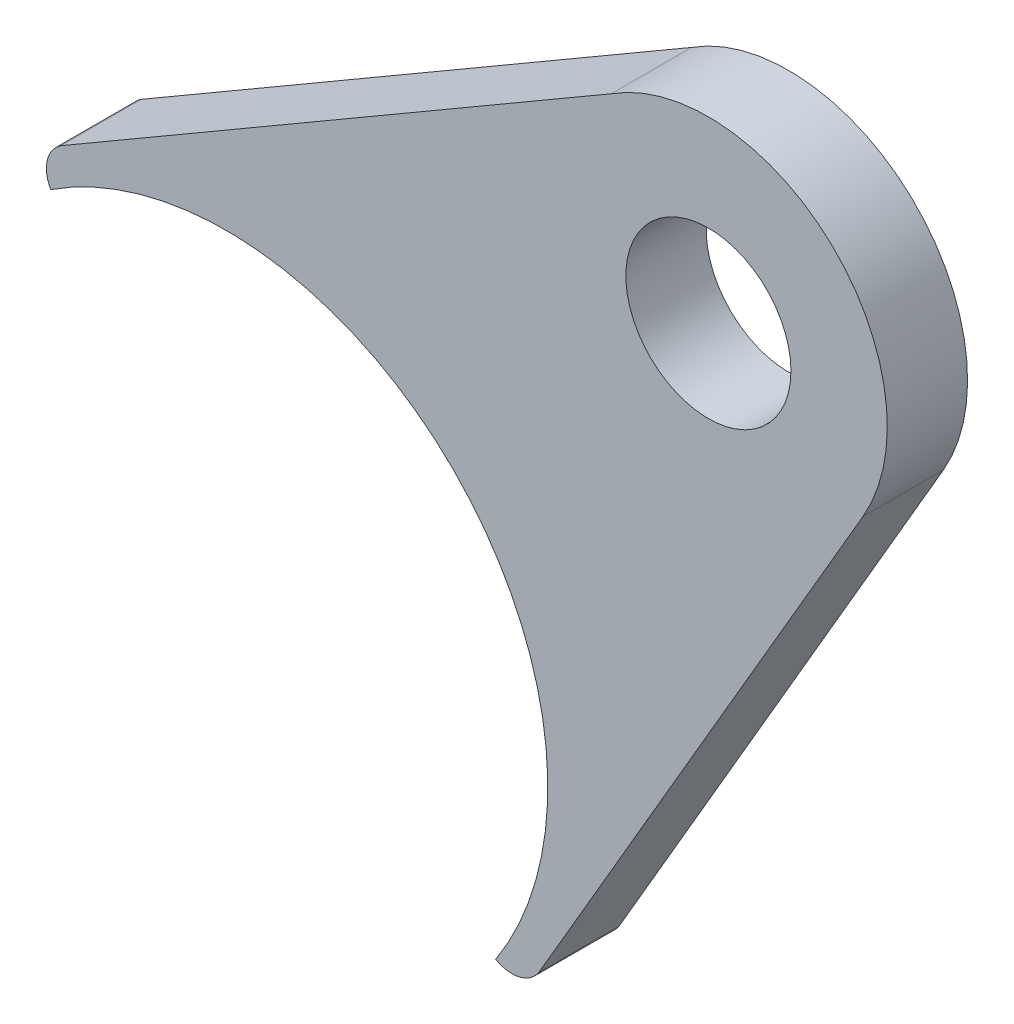
ISO-10303-21;
HEADER;
FILE_DESCRIPTION(('STEP AP214'),'2;1');
FILE_NAME('part.step','',(''),(''),'','','');
FILE_SCHEMA(('AUTOMOTIVE_DESIGN { 1 0 10303 214 1 1 1 1 }'));
ENDSEC;
DATA;
#1=APPLICATION_CONTEXT('core data for automotive mechanical design processes');
#2=APPLICATION_PROTOCOL_DEFINITION('international standard','automotive_design',2000,#1);
#3=PRODUCT_CONTEXT('',#1,'mechanical');
#4=PRODUCT('Part','Part','',(#3));
#5=PRODUCT_RELATED_PRODUCT_CATEGORY('part','',(#4));
#6=PRODUCT_DEFINITION_FORMATION('','',#4);
#7=PRODUCT_DEFINITION_CONTEXT('part definition',#1,'design');
#8=PRODUCT_DEFINITION('design','',#6,#7);
#9=PRODUCT_DEFINITION_SHAPE('','',#8);
#10=(LENGTH_UNIT() NAMED_UNIT(*) SI_UNIT(.MILLI.,.METRE.));
#11=(NAMED_UNIT(*) PLANE_ANGLE_UNIT() SI_UNIT($,.RADIAN.));
#12=(NAMED_UNIT(*) SI_UNIT($,.STERADIAN.) SOLID_ANGLE_UNIT());
#13=UNCERTAINTY_MEASURE_WITH_UNIT(LENGTH_MEASURE(1.E-05),#10,'distance_accuracy_value','');
#14=(GEOMETRIC_REPRESENTATION_CONTEXT(3) GLOBAL_UNCERTAINTY_ASSIGNED_CONTEXT((#13)) GLOBAL_UNIT_ASSIGNED_CONTEXT((#10,
#11,#12)) REPRESENTATION_CONTEXT('',''));
#15=CARTESIAN_POINT('',(0.,0.,0.));
#16=DIRECTION('',(0.,0.,1.));
#17=DIRECTION('',(1.,0.,0.));
#18=AXIS2_PLACEMENT_3D('',#15,#16,#17);
#19=CARTESIAN_POINT('',(-5.85837434433906,11.2675371729913,3.175));
#20=DIRECTION('',(0.,0.,-1.));
#21=DIRECTION('',(-1.,0.,0.));
#22=AXIS2_PLACEMENT_3D('',#19,#20,#21);
#23=PLANE('',#22);
#24=CARTESIAN_POINT('',(-5.85837434433906,11.2675371729913,3.175));
#25=DIRECTION('',(0.,0.,1.));
#26=DIRECTION('',(-1.,0.,0.));
#27=AXIS2_PLACEMENT_3D('',#24,#25,#26);
#28=CIRCLE('',#27,1.26999999999994);
#29=CARTESIAN_POINT('',(-6.54906316048158,12.3332993224671,3.175));
#30=VERTEX_POINT('',#29);
#31=CARTESIAN_POINT('',(-6.9547066047242,10.6264790049294,3.175));
#32=VERTEX_POINT('',#31);
#33=EDGE_CURVE('E139',#30,#32,#28,.T.);
#34=ORIENTED_EDGE('',*,*,#33,.T.);
#35=CARTESIAN_POINT('',(0.,0.,3.175));
#36=DIRECTION('',(0.,0.,-1.));
#37=DIRECTION('',(1.,0.,0.));
#38=AXIS2_PLACEMENT_3D('',#35,#36,#37);
#39=CIRCLE('',#38,12.7);
#40=CARTESIAN_POINT('',(10.6407084109418,-6.93291601804849,3.175));
#41=VERTEX_POINT('',#40);
#42=EDGE_CURVE('E97',#32,#41,#39,.T.);
#43=ORIENTED_EDGE('',*,*,#42,.T.);
#44=CARTESIAN_POINT('',(11.2818459493319,-5.83663017171689,3.175));
#45=DIRECTION('',(0.,0.,1.));
#46=DIRECTION('',(1.,0.,0.));
#47=AXIS2_PLACEMENT_3D('',#44,#45,#46);
#48=CIRCLE('',#47,1.27);
#49=CARTESIAN_POINT('',(12.3488934742751,-6.52533154351209,3.175));
#50=VERTEX_POINT('',#49);
#51=EDGE_CURVE('E110',#41,#50,#48,.T.);
#52=ORIENTED_EDGE('',*,*,#51,.T.);
#53=DIRECTION('',(0.503040153440547,0.864263040993025,0.));
#54=VECTOR('',#53,1.);
#55=CARTESIAN_POINT('',(12.3488934742751,-6.52533154351209,3.175));
#56=LINE('',#55,#54);
#57=CARTESIAN_POINT('',(25.1637103256806,15.4915442585769,3.175));
#58=VERTEX_POINT('',#57);
#59=EDGE_CURVE('E104',#50,#58,#56,.T.);
#60=ORIENTED_EDGE('',*,*,#59,.T.);
#61=CARTESIAN_POINT('',(19.05,19.05,3.175));
#62=DIRECTION('',(0.,0.,1.));
#63=DIRECTION('',(1.,0.,0.));
#64=AXIS2_PLACEMENT_3D('',#61,#62,#63);
#65=CIRCLE('',#64,7.07389999999995);
#66=CARTESIAN_POINT('',(15.2028632940858,24.9862951725809,3.175));
#67=VERTEX_POINT('',#66);
#68=EDGE_CURVE('E108',#58,#67,#65,.T.);
#69=ORIENTED_EDGE('',*,*,#68,.T.);
#70=DIRECTION('',(-0.86439446197605,-0.502814293855232,0.));
#71=VECTOR('',#70,1.);
#72=CARTESIAN_POINT('',(-6.54906316048158,12.3332993224671,3.175));
#73=LINE('',#72,#71);
#74=EDGE_CURVE('E60',#67,#30,#73,.T.);
#75=ORIENTED_EDGE('',*,*,#74,.T.);
#76=EDGE_LOOP('',(#34,#43,#52,#60,#69,#75));
#77=FACE_BOUND('',#76,.T.);
#78=CARTESIAN_POINT('',(19.05,19.05,3.175));
#79=DIRECTION('',(0.,0.,1.));
#80=DIRECTION('',(1.,0.,0.));
#81=AXIS2_PLACEMENT_3D('',#78,#79,#80);
#82=CIRCLE('',#81,3.2639);
#83=CARTESIAN_POINT('',(22.3139,19.05,3.175));
#84=VERTEX_POINT('',#83);
#85=EDGE_CURVE('E132',#84,#84,#82,.T.);
#86=ORIENTED_EDGE('',*,*,#85,.F.);
#87=EDGE_LOOP('',(#86));
#88=FACE_BOUND('',#87,.T.);
#89=ADVANCED_FACE('F43',(#77,#88),#23,.F.);
#90=CARTESIAN_POINT('',(-5.85837434433906,11.2675371729913,0.));
#91=DIRECTION('',(0.,0.,-1.));
#92=DIRECTION('',(-1.,0.,0.));
#93=AXIS2_PLACEMENT_3D('',#90,#91,#92);
#94=PLANE('',#93);
#95=CARTESIAN_POINT('',(-5.85837434433906,11.2675371729913,0.));
#96=DIRECTION('',(0.,0.,1.));
#97=DIRECTION('',(-1.,0.,0.));
#98=AXIS2_PLACEMENT_3D('',#95,#96,#97);
#99=CIRCLE('',#98,1.26999999999994);
#100=CARTESIAN_POINT('',(-6.54906316048158,12.3332993224671,0.));
#101=VERTEX_POINT('',#100);
#102=CARTESIAN_POINT('',(-6.9547066047242,10.6264790049294,0.));
#103=VERTEX_POINT('',#102);
#104=EDGE_CURVE('E128',#101,#103,#99,.T.);
#105=ORIENTED_EDGE('',*,*,#104,.F.);
#106=DIRECTION('',(-0.86439446197605,-0.502814293855232,0.));
#107=VECTOR('',#106,1.);
#108=CARTESIAN_POINT('',(-6.54906316048158,12.3332993224671,0.));
#109=LINE('',#108,#107);
#110=CARTESIAN_POINT('',(15.2028632940858,24.9862951725809,0.));
#111=VERTEX_POINT('',#110);
#112=EDGE_CURVE('E89',#111,#101,#109,.T.);
#113=ORIENTED_EDGE('',*,*,#112,.F.);
#114=CARTESIAN_POINT('',(19.05,19.05,0.));
#115=DIRECTION('',(0.,0.,1.));
#116=DIRECTION('',(1.,0.,0.));
#117=AXIS2_PLACEMENT_3D('',#114,#115,#116);
#118=CIRCLE('',#117,7.07389999999995);
#119=CARTESIAN_POINT('',(25.1637103256806,15.4915442585769,0.));
#120=VERTEX_POINT('',#119);
#121=EDGE_CURVE('E83',#120,#111,#118,.T.);
#122=ORIENTED_EDGE('',*,*,#121,.F.);
#123=DIRECTION('',(0.503040153440547,0.864263040993025,0.));
#124=VECTOR('',#123,1.);
#125=CARTESIAN_POINT('',(12.3488934742751,-6.52533154351209,0.));
#126=LINE('',#125,#124);
#127=CARTESIAN_POINT('',(12.3488934742751,-6.52533154351209,0.));
#128=VERTEX_POINT('',#127);
#129=EDGE_CURVE('E118',#128,#120,#126,.T.);
#130=ORIENTED_EDGE('',*,*,#129,.F.);
#131=CARTESIAN_POINT('',(11.2818459493319,-5.83663017171689,0.));
#132=DIRECTION('',(0.,0.,1.));
#133=DIRECTION('',(1.,0.,0.));
#134=AXIS2_PLACEMENT_3D('',#131,#132,#133);
#135=CIRCLE('',#134,1.27);
#136=CARTESIAN_POINT('',(10.6407084109418,-6.93291601804849,0.));
#137=VERTEX_POINT('',#136);
#138=EDGE_CURVE('E134',#137,#128,#135,.T.);
#139=ORIENTED_EDGE('',*,*,#138,.F.);
#140=CARTESIAN_POINT('',(0.,0.,0.));
#141=DIRECTION('',(0.,0.,-1.));
#142=DIRECTION('',(1.,0.,0.));
#143=AXIS2_PLACEMENT_3D('',#140,#141,#142);
#144=CIRCLE('',#143,12.7);
#145=EDGE_CURVE('E131',#103,#137,#144,.T.);
#146=ORIENTED_EDGE('',*,*,#145,.F.);
#147=EDGE_LOOP('',(#105,#113,#122,#130,#139,#146));
#148=FACE_BOUND('',#147,.T.);
#149=CARTESIAN_POINT('',(19.05,19.05,0.));
#150=DIRECTION('',(0.,0.,1.));
#151=DIRECTION('',(1.,0.,0.));
#152=AXIS2_PLACEMENT_3D('',#149,#150,#151);
#153=CIRCLE('',#152,3.2639);
#154=CARTESIAN_POINT('',(22.3139,19.05,0.));
#155=VERTEX_POINT('',#154);
#156=EDGE_CURVE('E232',#155,#155,#153,.T.);
#157=ORIENTED_EDGE('',*,*,#156,.T.);
#158=EDGE_LOOP('',(#157));
#159=FACE_BOUND('',#158,.T.);
#160=ADVANCED_FACE('F148',(#148,#159),#94,.T.);
#161=CARTESIAN_POINT('',(-5.85837434433906,11.2675371729913,3.175));
#162=DIRECTION('',(0.,0.,-1.));
#163=DIRECTION('',(-1.,0.,0.));
#164=AXIS2_PLACEMENT_3D('',#161,#162,#163);
#165=CYLINDRICAL_SURFACE('',#164,1.26999999999994);
#166=ORIENTED_EDGE('',*,*,#104,.T.);
#167=DIRECTION('',(0.,0.,-1.));
#168=VECTOR('',#167,1.);
#169=CARTESIAN_POINT('',(-6.9547066047242,10.6264790049294,3.175));
#170=LINE('',#169,#168);
#171=EDGE_CURVE('E11',#32,#103,#170,.T.);
#172=ORIENTED_EDGE('',*,*,#171,.F.);
#173=ORIENTED_EDGE('',*,*,#33,.F.);
#174=DIRECTION('',(0.,0.,-1.));
#175=VECTOR('',#174,1.);
#176=CARTESIAN_POINT('',(-6.54906316048158,12.3332993224671,3.175));
#177=LINE('',#176,#175);
#178=EDGE_CURVE('E124',#30,#101,#177,.T.);
#179=ORIENTED_EDGE('',*,*,#178,.T.);
#180=EDGE_LOOP('',(#166,#172,#173,#179));
#181=FACE_BOUND('',#180,.T.);
#182=ADVANCED_FACE('F45',(#181),#165,.T.);
#183=CARTESIAN_POINT('',(0.,0.,3.175));
#184=DIRECTION('',(0.,0.,-1.));
#185=DIRECTION('',(-1.,0.,0.));
#186=AXIS2_PLACEMENT_3D('',#183,#184,#185);
#187=CYLINDRICAL_SURFACE('',#186,12.7);
#188=ORIENTED_EDGE('',*,*,#145,.T.);
#189=DIRECTION('',(0.,0.,-1.));
#190=VECTOR('',#189,1.);
#191=CARTESIAN_POINT('',(10.6407084109418,-6.93291601804849,3.175));
#192=LINE('',#191,#190);
#193=EDGE_CURVE('E52',#41,#137,#192,.T.);
#194=ORIENTED_EDGE('',*,*,#193,.F.);
#195=ORIENTED_EDGE('',*,*,#42,.F.);
#196=ORIENTED_EDGE('',*,*,#171,.T.);
#197=EDGE_LOOP('',(#188,#194,#195,#196));
#198=FACE_BOUND('',#197,.T.);
#199=ADVANCED_FACE('F173',(#198),#187,.F.);
#200=CARTESIAN_POINT('',(11.2818459493319,-5.83663017171689,3.175));
#201=DIRECTION('',(0.,0.,-1.));
#202=DIRECTION('',(-1.,0.,0.));
#203=AXIS2_PLACEMENT_3D('',#200,#201,#202);
#204=CYLINDRICAL_SURFACE('',#203,1.27);
#205=ORIENTED_EDGE('',*,*,#138,.T.);
#206=DIRECTION('',(0.,0.,-1.));
#207=VECTOR('',#206,1.);
#208=CARTESIAN_POINT('',(12.3488934742751,-6.52533154351209,3.175));
#209=LINE('',#208,#207);
#210=EDGE_CURVE('E119',#50,#128,#209,.T.);
#211=ORIENTED_EDGE('',*,*,#210,.F.);
#212=ORIENTED_EDGE('',*,*,#51,.F.);
#213=ORIENTED_EDGE('',*,*,#193,.T.);
#214=EDGE_LOOP('',(#205,#211,#212,#213));
#215=FACE_BOUND('',#214,.T.);
#216=ADVANCED_FACE('F145',(#215),#204,.T.);
#217=CARTESIAN_POINT('',(12.3488934742751,-6.52533154351209,3.175));
#218=DIRECTION('',(-0.864263040993025,0.503040153440547,0.));
#219=DIRECTION('',(-0.503040153440547,-0.864263040993025,0.));
#220=AXIS2_PLACEMENT_3D('',#217,#218,#219);
#221=PLANE('',#220);
#222=ORIENTED_EDGE('',*,*,#129,.T.);
#223=DIRECTION('',(0.,0.,-1.));
#224=VECTOR('',#223,1.);
#225=CARTESIAN_POINT('',(25.1637103256806,15.4915442585769,3.175));
#226=LINE('',#225,#224);
#227=EDGE_CURVE('E115',#58,#120,#226,.T.);
#228=ORIENTED_EDGE('',*,*,#227,.F.);
#229=ORIENTED_EDGE('',*,*,#59,.F.);
#230=ORIENTED_EDGE('',*,*,#210,.T.);
#231=EDGE_LOOP('',(#222,#228,#229,#230));
#232=FACE_BOUND('',#231,.T.);
#233=ADVANCED_FACE('F116',(#232),#221,.F.);
#234=CARTESIAN_POINT('',(19.05,19.05,3.175));
#235=DIRECTION('',(0.,0.,-1.));
#236=DIRECTION('',(-1.,0.,0.));
#237=AXIS2_PLACEMENT_3D('',#234,#235,#236);
#238=CYLINDRICAL_SURFACE('',#237,7.07389999999995);
#239=ORIENTED_EDGE('',*,*,#121,.T.);
#240=DIRECTION('',(0.,0.,-1.));
#241=VECTOR('',#240,1.);
#242=CARTESIAN_POINT('',(15.2028632940858,24.9862951725809,3.175));
#243=LINE('',#242,#241);
#244=EDGE_CURVE('E120',#67,#111,#243,.T.);
#245=ORIENTED_EDGE('',*,*,#244,.F.);
#246=ORIENTED_EDGE('',*,*,#68,.F.);
#247=ORIENTED_EDGE('',*,*,#227,.T.);
#248=EDGE_LOOP('',(#239,#245,#246,#247));
#249=FACE_BOUND('',#248,.T.);
#250=ADVANCED_FACE('F122',(#249),#238,.T.);
#251=CARTESIAN_POINT('',(-6.54906316048158,12.3332993224671,3.175));
#252=DIRECTION('',(0.502814293855232,-0.86439446197605,0.));
#253=DIRECTION('',(0.86439446197605,0.502814293855232,0.));
#254=AXIS2_PLACEMENT_3D('',#251,#252,#253);
#255=PLANE('',#254);
#256=ORIENTED_EDGE('',*,*,#112,.T.);
#257=ORIENTED_EDGE('',*,*,#178,.F.);
#258=ORIENTED_EDGE('',*,*,#74,.F.);
#259=ORIENTED_EDGE('',*,*,#244,.T.);
#260=EDGE_LOOP('',(#256,#257,#258,#259));
#261=FACE_BOUND('',#260,.T.);
#262=ADVANCED_FACE('F153',(#261),#255,.F.);
#263=CARTESIAN_POINT('',(19.05,19.05,3.175));
#264=DIRECTION('',(0.,0.,-1.));
#265=DIRECTION('',(-1.,0.,0.));
#266=AXIS2_PLACEMENT_3D('',#263,#264,#265);
#267=CYLINDRICAL_SURFACE('',#266,3.2639);
#268=ORIENTED_EDGE('',*,*,#85,.T.);
#269=EDGE_LOOP('',(#268));
#270=FACE_BOUND('',#269,.T.);
#271=ORIENTED_EDGE('',*,*,#156,.F.);
#272=EDGE_LOOP('',(#271));
#273=FACE_BOUND('',#272,.T.);
#274=ADVANCED_FACE('F155',(#270,#273),#267,.F.);
#275=CLOSED_SHELL('',(#89,#160,#182,#199,#216,#233,#250,#262,#274));
#276=MANIFOLD_SOLID_BREP('B2',#275);
#277=ADVANCED_BREP_SHAPE_REPRESENTATION('',(#18,#276),#14);
#278=SHAPE_DEFINITION_REPRESENTATION(#9,#277);
ENDSEC;
END-ISO-10303-21;
